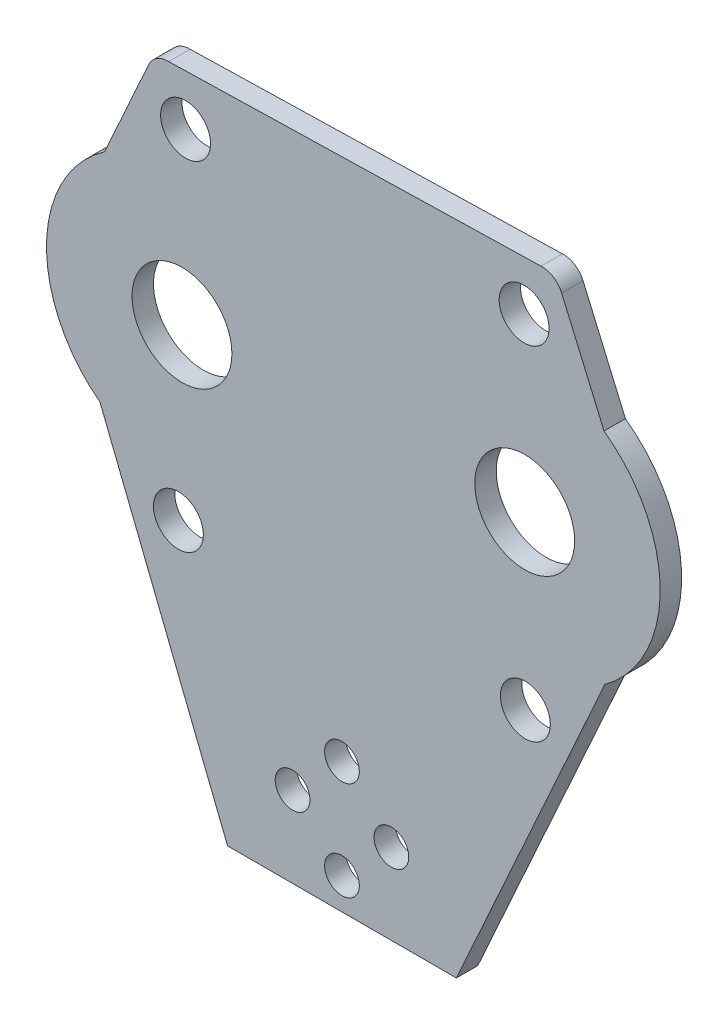
ISO-10303-21;
HEADER;
FILE_DESCRIPTION(('STEP AP214'),'2;1');
FILE_NAME('part.step','',(''),(''),'','','');
FILE_SCHEMA(('AUTOMOTIVE_DESIGN { 1 0 10303 214 1 1 1 1 }'));
ENDSEC;
DATA;
#1=APPLICATION_CONTEXT('core data for automotive mechanical design processes');
#2=APPLICATION_PROTOCOL_DEFINITION('international standard','automotive_design',2000,#1);
#3=PRODUCT_CONTEXT('',#1,'mechanical');
#4=PRODUCT('Part','Part','',(#3));
#5=PRODUCT_RELATED_PRODUCT_CATEGORY('part','',(#4));
#6=PRODUCT_DEFINITION_FORMATION('','',#4);
#7=PRODUCT_DEFINITION_CONTEXT('part definition',#1,'design');
#8=PRODUCT_DEFINITION('design','',#6,#7);
#9=PRODUCT_DEFINITION_SHAPE('','',#8);
#10=(LENGTH_UNIT() NAMED_UNIT(*) SI_UNIT(.MILLI.,.METRE.));
#11=(NAMED_UNIT(*) PLANE_ANGLE_UNIT() SI_UNIT($,.RADIAN.));
#12=(NAMED_UNIT(*) SI_UNIT($,.STERADIAN.) SOLID_ANGLE_UNIT());
#13=UNCERTAINTY_MEASURE_WITH_UNIT(LENGTH_MEASURE(1.E-05),#10,'distance_accuracy_value','');
#14=(GEOMETRIC_REPRESENTATION_CONTEXT(3) GLOBAL_UNCERTAINTY_ASSIGNED_CONTEXT((#13)) GLOBAL_UNIT_ASSIGNED_CONTEXT((#10,
#11,#12)) REPRESENTATION_CONTEXT('',''));
#15=CARTESIAN_POINT('',(0.,0.,0.));
#16=DIRECTION('',(0.,0.,1.));
#17=DIRECTION('',(1.,0.,0.));
#18=AXIS2_PLACEMENT_3D('',#15,#16,#17);
#19=CARTESIAN_POINT('',(0.,0.,0.));
#20=DIRECTION('',(0.,0.,1.));
#21=DIRECTION('',(1.,0.,0.));
#22=AXIS2_PLACEMENT_3D('',#19,#20,#21);
#23=PLANE('',#22);
#24=CARTESIAN_POINT('',(47.9795394637293,-77.5227826361399,0.));
#25=DIRECTION('',(0.,0.,1.));
#26=DIRECTION('',(1.,0.,0.));
#27=AXIS2_PLACEMENT_3D('',#24,#25,#26);
#28=CIRCLE('',#27,2.43527256951893);
#29=CARTESIAN_POINT('',(50.4148120332482,-77.5227826361399,0.));
#30=VERTEX_POINT('',#29);
#31=EDGE_CURVE('E237',#30,#30,#28,.T.);
#32=ORIENTED_EDGE('',*,*,#31,.T.);
#33=EDGE_LOOP('',(#32));
#34=FACE_BOUND('',#33,.T.);
#35=CARTESIAN_POINT('',(25.0430845381202,-59.7097072397897,0.));
#36=DIRECTION('',(0.,0.,1.));
#37=DIRECTION('',(1.,0.,0.));
#38=AXIS2_PLACEMENT_3D('',#35,#36,#37);
#39=CIRCLE('',#38,3.49999999999999);
#40=CARTESIAN_POINT('',(28.5430845381202,-59.7097072397897,0.));
#41=VERTEX_POINT('',#40);
#42=EDGE_CURVE('E241',#41,#41,#39,.T.);
#43=ORIENTED_EDGE('',*,*,#42,.T.);
#44=EDGE_LOOP('',(#43));
#45=FACE_BOUND('',#44,.T.);
#46=CARTESIAN_POINT('',(26.0475927384278,-11.7202191900561,0.));
#47=DIRECTION('',(0.,0.,1.));
#48=DIRECTION('',(1.,0.,0.));
#49=AXIS2_PLACEMENT_3D('',#46,#47,#48);
#50=CIRCLE('',#49,3.50000000000216);
#51=CARTESIAN_POINT('',(29.54759273843,-11.7202191900561,0.));
#52=VERTEX_POINT('',#51);
#53=EDGE_CURVE('E245',#52,#52,#50,.T.);
#54=ORIENTED_EDGE('',*,*,#53,.T.);
#55=EDGE_LOOP('',(#54));
#56=FACE_BOUND('',#55,.T.);
#57=CARTESIAN_POINT('',(73.6924071148828,-58.4168393325101,0.));
#58=DIRECTION('',(0.,0.,1.));
#59=DIRECTION('',(1.,0.,0.));
#60=AXIS2_PLACEMENT_3D('',#57,#58,#59);
#61=CIRCLE('',#60,3.50000000000217);
#62=CARTESIAN_POINT('',(77.1924071148849,-58.4168393325101,0.));
#63=VERTEX_POINT('',#62);
#64=EDGE_CURVE('E249',#63,#63,#61,.T.);
#65=ORIENTED_EDGE('',*,*,#64,.T.);
#66=EDGE_LOOP('',(#65));
#67=FACE_BOUND('',#66,.T.);
#68=CARTESIAN_POINT('',(54.9066241544598,-84.4498673268705,0.));
#69=DIRECTION('',(0.,0.,1.));
#70=DIRECTION('',(1.,0.,0.));
#71=AXIS2_PLACEMENT_3D('',#68,#69,#70);
#72=CIRCLE('',#71,2.43527256951893);
#73=CARTESIAN_POINT('',(57.3418967239788,-84.4498673268705,0.));
#74=VERTEX_POINT('',#73);
#75=EDGE_CURVE('E253',#74,#74,#72,.T.);
#76=ORIENTED_EDGE('',*,*,#75,.T.);
#77=EDGE_LOOP('',(#76));
#78=FACE_BOUND('',#77,.T.);
#79=CARTESIAN_POINT('',(25.5453386382778,-35.714963214923,0.));
#80=DIRECTION('',(0.,0.,1.));
#81=DIRECTION('',(1.,0.,0.));
#82=AXIS2_PLACEMENT_3D('',#79,#80,#81);
#83=CIRCLE('',#82,7.);
#84=CARTESIAN_POINT('',(32.5453386382778,-35.714963214923,0.));
#85=VERTEX_POINT('',#84);
#86=EDGE_CURVE('E257',#85,#85,#83,.T.);
#87=ORIENTED_EDGE('',*,*,#86,.T.);
#88=EDGE_LOOP('',(#87));
#89=FACE_BOUND('',#88,.T.);
#90=CARTESIAN_POINT('',(47.9795394637292,-91.3769520176011,0.));
#91=DIRECTION('',(0.,0.,1.));
#92=DIRECTION('',(1.,0.,0.));
#93=AXIS2_PLACEMENT_3D('',#90,#91,#92);
#94=CIRCLE('',#93,2.43527256951894);
#95=CARTESIAN_POINT('',(50.4148120332481,-91.3769520176011,0.));
#96=VERTEX_POINT('',#95);
#97=EDGE_CURVE('E261',#96,#96,#94,.T.);
#98=ORIENTED_EDGE('',*,*,#97,.T.);
#99=EDGE_LOOP('',(#98));
#100=FACE_BOUND('',#99,.T.);
#101=CARTESIAN_POINT('',(41.0524547729986,-84.4498673268704,0.));
#102=DIRECTION('',(0.,0.,1.));
#103=DIRECTION('',(1.,0.,0.));
#104=AXIS2_PLACEMENT_3D('',#101,#102,#103);
#105=CIRCLE('',#104,2.43527256951893);
#106=CARTESIAN_POINT('',(43.4877273425175,-84.4498673268704,0.));
#107=VERTEX_POINT('',#106);
#108=EDGE_CURVE('E265',#107,#107,#105,.T.);
#109=ORIENTED_EDGE('',*,*,#108,.T.);
#110=EDGE_LOOP('',(#109));
#111=FACE_BOUND('',#110,.T.);
#112=CARTESIAN_POINT('',(73.5196330549074,-10.4171502801402,0.));
#113=DIRECTION('',(0.,0.,1.));
#114=DIRECTION('',(1.,0.,0.));
#115=AXIS2_PLACEMENT_3D('',#112,#113,#114);
#116=CIRCLE('',#115,3.49999999999999);
#117=CARTESIAN_POINT('',(77.0196330549074,-10.4171502801402,0.));
#118=VERTEX_POINT('',#117);
#119=EDGE_CURVE('E269',#118,#118,#116,.T.);
#120=ORIENTED_EDGE('',*,*,#119,.T.);
#121=EDGE_LOOP('',(#120));
#122=FACE_BOUND('',#121,.T.);
#123=CARTESIAN_POINT('',(73.6060200848913,-34.4169948063252,0.));
#124=DIRECTION('',(0.,0.,1.));
#125=DIRECTION('',(1.,0.,0.));
#126=AXIS2_PLACEMENT_3D('',#123,#124,#125);
#127=CIRCLE('',#126,7.00000000000002);
#128=CARTESIAN_POINT('',(80.6060200848913,-34.4169948063252,0.));
#129=VERTEX_POINT('',#128);
#130=EDGE_CURVE('E152',#129,#129,#127,.T.);
#131=ORIENTED_EDGE('',*,*,#130,.T.);
#132=EDGE_LOOP('',(#131));
#133=FACE_BOUND('',#132,.T.);
#134=CARTESIAN_POINT('',(23.6128119382138,-7.66837856449386,0.));
#135=DIRECTION('',(0.,0.,1.));
#136=DIRECTION('',(1.,0.,0.));
#137=AXIS2_PLACEMENT_3D('',#134,#135,#136);
#138=CIRCLE('',#137,3.);
#139=CARTESIAN_POINT('',(23.6755937007325,-4.66903556138551,0.));
#140=VERTEX_POINT('',#139);
#141=CARTESIAN_POINT('',(20.8791196646464,-6.43268986848738,0.));
#142=VERTEX_POINT('',#141);
#143=EDGE_CURVE('E117',#140,#142,#138,.T.);
#144=ORIENTED_EDGE('',*,*,#143,.F.);
#145=DIRECTION('',(-0.999709921768373,-0.0240846905289178,0.));
#146=VECTOR('',#145,1.);
#147=CARTESIAN_POINT('',(0.126153213121975,-5.23638112225579,0.));
#148=LINE('',#147,#146);
#149=CARTESIAN_POINT('',(75.8905809448477,-3.41108884968199,0.));
#150=VERTEX_POINT('',#149);
#151=EDGE_CURVE('E110',#150,#140,#148,.T.);
#152=ORIENTED_EDGE('',*,*,#151,.F.);
#153=CARTESIAN_POINT('',(76.0242603824249,-6.40810900443055,0.));
#154=DIRECTION('',(0.,0.,1.));
#155=DIRECTION('',(1.,0.,0.));
#156=AXIS2_PLACEMENT_3D('',#153,#154,#155);
#157=CIRCLE('',#156,3.00000000000001);
#158=CARTESIAN_POINT('',(78.7789547617845,-5.2199764881157,0.));
#159=VERTEX_POINT('',#158);
#160=EDGE_CURVE('E116',#159,#150,#157,.T.);
#161=ORIENTED_EDGE('',*,*,#160,.F.);
#162=DIRECTION('',(-0.396044172104949,0.918231459786532,0.));
#163=VECTOR('',#162,1.);
#164=CARTESIAN_POINT('',(64.5241002218544,27.8300134250703,0.));
#165=LINE('',#164,#163);
#166=CARTESIAN_POINT('',(84.7276966295057,-19.0121802719994,0.));
#167=VERTEX_POINT('',#166);
#168=EDGE_CURVE('E135',#167,#159,#165,.T.);
#169=ORIENTED_EDGE('',*,*,#168,.F.);
#170=CARTESIAN_POINT('',(73.6060200848913,-34.4169948063252,0.));
#171=DIRECTION('',(0.,0.,1.));
#172=DIRECTION('',(1.,0.,0.));
#173=AXIS2_PLACEMENT_3D('',#170,#171,#172);
#174=CIRCLE('',#173,19.);
#175=CARTESIAN_POINT('',(84.8383057383807,-49.7413466359595,0.));
#176=VERTEX_POINT('',#175);
#177=EDGE_CURVE('E137',#176,#167,#174,.T.);
#178=ORIENTED_EDGE('',*,*,#177,.F.);
#179=DIRECTION('',(-0.411896232002161,-0.911230757855781,0.));
#180=VECTOR('',#179,1.);
#181=CARTESIAN_POINT('',(89.1143103049896,-40.2816172694491,0.));
#182=LINE('',#181,#180);
#183=CARTESIAN_POINT('',(64.0242125998881,-95.7879972024786,0.));
#184=VERTEX_POINT('',#183);
#185=EDGE_CURVE('E139',#176,#184,#182,.T.);
#186=ORIENTED_EDGE('',*,*,#185,.T.);
#187=DIRECTION('',(-1.,0.,0.));
#188=VECTOR('',#187,1.);
#189=CARTESIAN_POINT('',(0.,-95.7879972024786,0.));
#190=LINE('',#189,#188);
#191=CARTESIAN_POINT('',(31.9348663275706,-95.7879972024786,0.));
#192=VERTEX_POINT('',#191);
#193=EDGE_CURVE('E142',#184,#192,#190,.T.);
#194=ORIENTED_EDGE('',*,*,#193,.T.);
#195=DIRECTION('',(0.369740315998058,-0.929135134803144,0.));
#196=VECTOR('',#195,1.);
#197=CARTESIAN_POINT('',(-5.33776801751495,-2.12411301606676,0.));
#198=LINE('',#197,#196);
#199=CARTESIAN_POINT('',(14.0491922760877,-50.8423760412824,0.));
#200=VERTEX_POINT('',#199);
#201=EDGE_CURVE('E145',#200,#192,#198,.T.);
#202=ORIENTED_EDGE('',*,*,#201,.F.);
#203=CARTESIAN_POINT('',(25.5453386382778,-35.714963214923,0.));
#204=DIRECTION('',(0.,0.,1.));
#205=DIRECTION('',(1.,0.,0.));
#206=AXIS2_PLACEMENT_3D('',#203,#204,#205);
#207=CIRCLE('',#206,19.);
#208=CARTESIAN_POINT('',(14.692273517042,-20.1197403093594,0.));
#209=VERTEX_POINT('',#208);
#210=EDGE_CURVE('E147',#209,#200,#207,.T.);
#211=ORIENTED_EDGE('',*,*,#210,.F.);
#212=DIRECTION('',(0.411896232002162,0.911230757855781,0.));
#213=VECTOR('',#212,1.);
#214=CARTESIAN_POINT('',(19.7511970877558,-8.92797306043775,0.));
#215=LINE('',#214,#213);
#216=EDGE_CURVE('E121',#209,#142,#215,.T.);
#217=ORIENTED_EDGE('',*,*,#216,.T.);
#218=EDGE_LOOP('',(#144,#152,#161,#169,#178,#186,#194,#202,#211,#217));
#219=FACE_BOUND('',#218,.T.);
#220=ADVANCED_FACE('F34',(#34,#45,#56,#67,#78,#89,#100,#111,#122,#133,#219),#23,.F.);
#221=CARTESIAN_POINT('',(23.6128119382138,-7.66837856449386,0.));
#222=DIRECTION('',(0.,0.,1.));
#223=DIRECTION('',(1.,0.,0.));
#224=AXIS2_PLACEMENT_3D('',#221,#222,#223);
#225=CYLINDRICAL_SURFACE('',#224,3.);
#226=CARTESIAN_POINT('',(23.6128119382138,-7.66837856449386,3.));
#227=DIRECTION('',(0.,0.,1.));
#228=DIRECTION('',(1.,0.,0.));
#229=AXIS2_PLACEMENT_3D('',#226,#227,#228);
#230=CIRCLE('',#229,3.);
#231=CARTESIAN_POINT('',(23.6755937007325,-4.66903556138551,3.));
#232=VERTEX_POINT('',#231);
#233=CARTESIAN_POINT('',(20.8791196646464,-6.43268986848738,3.));
#234=VERTEX_POINT('',#233);
#235=EDGE_CURVE('E49',#232,#234,#230,.T.);
#236=ORIENTED_EDGE('',*,*,#235,.F.);
#237=DIRECTION('',(0.,0.,1.));
#238=VECTOR('',#237,1.);
#239=CARTESIAN_POINT('',(23.6755937007325,-4.66903556138551,0.));
#240=LINE('',#239,#238);
#241=EDGE_CURVE('E37',#140,#232,#240,.T.);
#242=ORIENTED_EDGE('',*,*,#241,.F.);
#243=ORIENTED_EDGE('',*,*,#143,.T.);
#244=DIRECTION('',(0.,0.,1.));
#245=VECTOR('',#244,1.);
#246=CARTESIAN_POINT('',(20.8791196646464,-6.43268986848738,0.));
#247=LINE('',#246,#245);
#248=EDGE_CURVE('E12',#142,#234,#247,.T.);
#249=ORIENTED_EDGE('',*,*,#248,.T.);
#250=EDGE_LOOP('',(#236,#242,#243,#249));
#251=FACE_BOUND('',#250,.T.);
#252=ADVANCED_FACE('F119',(#251),#225,.T.);
#253=CARTESIAN_POINT('',(19.7511970877558,-8.92797306043775,0.));
#254=DIRECTION('',(0.911230757855781,-0.411896232002162,0.));
#255=DIRECTION('',(0.411896232002162,0.911230757855781,0.));
#256=AXIS2_PLACEMENT_3D('',#253,#254,#255);
#257=PLANE('',#256);
#258=DIRECTION('',(0.411896232002162,0.911230757855781,0.));
#259=VECTOR('',#258,1.);
#260=CARTESIAN_POINT('',(19.7511970877558,-8.92797306043775,3.));
#261=LINE('',#260,#259);
#262=CARTESIAN_POINT('',(14.692273517042,-20.1197403093594,3.));
#263=VERTEX_POINT('',#262);
#264=EDGE_CURVE('E125',#263,#234,#261,.T.);
#265=ORIENTED_EDGE('',*,*,#264,.T.);
#266=ORIENTED_EDGE('',*,*,#248,.F.);
#267=ORIENTED_EDGE('',*,*,#216,.F.);
#268=DIRECTION('',(0.,0.,1.));
#269=VECTOR('',#268,1.);
#270=CARTESIAN_POINT('',(14.692273517042,-20.1197403093594,0.));
#271=LINE('',#270,#269);
#272=EDGE_CURVE('E42',#209,#263,#271,.T.);
#273=ORIENTED_EDGE('',*,*,#272,.T.);
#274=EDGE_LOOP('',(#265,#266,#267,#273));
#275=FACE_BOUND('',#274,.T.);
#276=ADVANCED_FACE('F220',(#275),#257,.F.);
#277=CARTESIAN_POINT('',(25.5453386382778,-35.714963214923,0.));
#278=DIRECTION('',(0.,0.,1.));
#279=DIRECTION('',(1.,0.,0.));
#280=AXIS2_PLACEMENT_3D('',#277,#278,#279);
#281=CYLINDRICAL_SURFACE('',#280,19.);
#282=CARTESIAN_POINT('',(25.5453386382778,-35.714963214923,3.));
#283=DIRECTION('',(0.,0.,1.));
#284=DIRECTION('',(1.,0.,0.));
#285=AXIS2_PLACEMENT_3D('',#282,#283,#284);
#286=CIRCLE('',#285,19.);
#287=CARTESIAN_POINT('',(14.0491922760877,-50.8423760412824,3.));
#288=VERTEX_POINT('',#287);
#289=EDGE_CURVE('E128',#263,#288,#286,.T.);
#290=ORIENTED_EDGE('',*,*,#289,.F.);
#291=ORIENTED_EDGE('',*,*,#272,.F.);
#292=ORIENTED_EDGE('',*,*,#210,.T.);
#293=DIRECTION('',(0.,0.,1.));
#294=VECTOR('',#293,1.);
#295=CARTESIAN_POINT('',(14.0491922760877,-50.8423760412824,0.));
#296=LINE('',#295,#294);
#297=EDGE_CURVE('E175',#200,#288,#296,.T.);
#298=ORIENTED_EDGE('',*,*,#297,.T.);
#299=EDGE_LOOP('',(#290,#291,#292,#298));
#300=FACE_BOUND('',#299,.T.);
#301=ADVANCED_FACE('F217',(#300),#281,.T.);
#302=CARTESIAN_POINT('',(-5.33776801751495,-2.12411301606676,0.));
#303=DIRECTION('',(-0.929135134803144,-0.369740315998058,0.));
#304=DIRECTION('',(0.369740315998058,-0.929135134803144,0.));
#305=AXIS2_PLACEMENT_3D('',#302,#303,#304);
#306=PLANE('',#305);
#307=DIRECTION('',(0.369740315998058,-0.929135134803144,0.));
#308=VECTOR('',#307,1.);
#309=CARTESIAN_POINT('',(-5.33776801751495,-2.12411301606676,3.));
#310=LINE('',#309,#308);
#311=CARTESIAN_POINT('',(31.9348663275706,-95.7879972024786,3.));
#312=VERTEX_POINT('',#311);
#313=EDGE_CURVE('E169',#288,#312,#310,.T.);
#314=ORIENTED_EDGE('',*,*,#313,.F.);
#315=ORIENTED_EDGE('',*,*,#297,.F.);
#316=ORIENTED_EDGE('',*,*,#201,.T.);
#317=DIRECTION('',(0.,0.,1.));
#318=VECTOR('',#317,1.);
#319=CARTESIAN_POINT('',(31.9348663275706,-95.7879972024786,0.));
#320=LINE('',#319,#318);
#321=EDGE_CURVE('E177',#192,#312,#320,.T.);
#322=ORIENTED_EDGE('',*,*,#321,.T.);
#323=EDGE_LOOP('',(#314,#315,#316,#322));
#324=FACE_BOUND('',#323,.T.);
#325=ADVANCED_FACE('F214',(#324),#306,.T.);
#326=CARTESIAN_POINT('',(0.,-95.7879972024786,0.));
#327=DIRECTION('',(0.,1.,0.));
#328=DIRECTION('',(0.,0.,1.));
#329=AXIS2_PLACEMENT_3D('',#326,#327,#328);
#330=PLANE('',#329);
#331=DIRECTION('',(-1.,0.,0.));
#332=VECTOR('',#331,1.);
#333=CARTESIAN_POINT('',(0.,-95.7879972024786,3.));
#334=LINE('',#333,#332);
#335=CARTESIAN_POINT('',(64.0242125998881,-95.7879972024786,3.));
#336=VERTEX_POINT('',#335);
#337=EDGE_CURVE('E166',#336,#312,#334,.T.);
#338=ORIENTED_EDGE('',*,*,#337,.T.);
#339=ORIENTED_EDGE('',*,*,#321,.F.);
#340=ORIENTED_EDGE('',*,*,#193,.F.);
#341=DIRECTION('',(0.,0.,1.));
#342=VECTOR('',#341,1.);
#343=CARTESIAN_POINT('',(64.0242125998881,-95.7879972024786,0.));
#344=LINE('',#343,#342);
#345=EDGE_CURVE('E179',#184,#336,#344,.T.);
#346=ORIENTED_EDGE('',*,*,#345,.T.);
#347=EDGE_LOOP('',(#338,#339,#340,#346));
#348=FACE_BOUND('',#347,.T.);
#349=ADVANCED_FACE('F209',(#348),#330,.F.);
#350=CARTESIAN_POINT('',(89.1143103049896,-40.2816172694491,0.));
#351=DIRECTION('',(-0.911230757855781,0.411896232002161,0.));
#352=DIRECTION('',(-0.411896232002162,-0.911230757855781,0.));
#353=AXIS2_PLACEMENT_3D('',#350,#351,#352);
#354=PLANE('',#353);
#355=DIRECTION('',(-0.411896232002161,-0.911230757855781,0.));
#356=VECTOR('',#355,1.);
#357=CARTESIAN_POINT('',(89.1143103049896,-40.2816172694491,3.));
#358=LINE('',#357,#356);
#359=CARTESIAN_POINT('',(84.8383057383807,-49.7413466359595,3.));
#360=VERTEX_POINT('',#359);
#361=EDGE_CURVE('E163',#360,#336,#358,.T.);
#362=ORIENTED_EDGE('',*,*,#361,.T.);
#363=ORIENTED_EDGE('',*,*,#345,.F.);
#364=ORIENTED_EDGE('',*,*,#185,.F.);
#365=DIRECTION('',(0.,0.,1.));
#366=VECTOR('',#365,1.);
#367=CARTESIAN_POINT('',(84.8383057383807,-49.7413466359595,0.));
#368=LINE('',#367,#366);
#369=EDGE_CURVE('E181',#176,#360,#368,.T.);
#370=ORIENTED_EDGE('',*,*,#369,.T.);
#371=EDGE_LOOP('',(#362,#363,#364,#370));
#372=FACE_BOUND('',#371,.T.);
#373=ADVANCED_FACE('F204',(#372),#354,.F.);
#374=CARTESIAN_POINT('',(73.6060200848913,-34.4169948063252,0.));
#375=DIRECTION('',(0.,0.,1.));
#376=DIRECTION('',(1.,0.,0.));
#377=AXIS2_PLACEMENT_3D('',#374,#375,#376);
#378=CYLINDRICAL_SURFACE('',#377,19.);
#379=CARTESIAN_POINT('',(73.6060200848913,-34.4169948063252,3.));
#380=DIRECTION('',(0.,0.,1.));
#381=DIRECTION('',(1.,0.,0.));
#382=AXIS2_PLACEMENT_3D('',#379,#380,#381);
#383=CIRCLE('',#382,19.);
#384=CARTESIAN_POINT('',(84.7276966295057,-19.0121802719994,3.));
#385=VERTEX_POINT('',#384);
#386=EDGE_CURVE('E160',#360,#385,#383,.T.);
#387=ORIENTED_EDGE('',*,*,#386,.F.);
#388=ORIENTED_EDGE('',*,*,#369,.F.);
#389=ORIENTED_EDGE('',*,*,#177,.T.);
#390=DIRECTION('',(0.,0.,1.));
#391=VECTOR('',#390,1.);
#392=CARTESIAN_POINT('',(84.7276966295057,-19.0121802719994,0.));
#393=LINE('',#392,#391);
#394=EDGE_CURVE('E183',#167,#385,#393,.T.);
#395=ORIENTED_EDGE('',*,*,#394,.T.);
#396=EDGE_LOOP('',(#387,#388,#389,#395));
#397=FACE_BOUND('',#396,.T.);
#398=ADVANCED_FACE('F202',(#397),#378,.T.);
#399=CARTESIAN_POINT('',(64.5241002218544,27.8300134250703,0.));
#400=DIRECTION('',(0.918231459786532,0.396044172104949,0.));
#401=DIRECTION('',(-0.396044172104949,0.918231459786532,0.));
#402=AXIS2_PLACEMENT_3D('',#399,#400,#401);
#403=PLANE('',#402);
#404=DIRECTION('',(-0.396044172104949,0.918231459786532,0.));
#405=VECTOR('',#404,1.);
#406=CARTESIAN_POINT('',(64.5241002218544,27.8300134250703,3.));
#407=LINE('',#406,#405);
#408=CARTESIAN_POINT('',(78.7789547617845,-5.2199764881157,3.));
#409=VERTEX_POINT('',#408);
#410=EDGE_CURVE('E157',#385,#409,#407,.T.);
#411=ORIENTED_EDGE('',*,*,#410,.F.);
#412=ORIENTED_EDGE('',*,*,#394,.F.);
#413=ORIENTED_EDGE('',*,*,#168,.T.);
#414=DIRECTION('',(0.,0.,1.));
#415=VECTOR('',#414,1.);
#416=CARTESIAN_POINT('',(78.7789547617845,-5.2199764881157,0.));
#417=LINE('',#416,#415);
#418=EDGE_CURVE('E185',#159,#409,#417,.T.);
#419=ORIENTED_EDGE('',*,*,#418,.T.);
#420=EDGE_LOOP('',(#411,#412,#413,#419));
#421=FACE_BOUND('',#420,.T.);
#422=ADVANCED_FACE('F197',(#421),#403,.T.);
#423=CARTESIAN_POINT('',(76.0242603824249,-6.40810900443055,0.));
#424=DIRECTION('',(0.,0.,1.));
#425=DIRECTION('',(1.,0.,0.));
#426=AXIS2_PLACEMENT_3D('',#423,#424,#425);
#427=CYLINDRICAL_SURFACE('',#426,3.00000000000001);
#428=CARTESIAN_POINT('',(76.0242603824249,-6.40810900443055,3.));
#429=DIRECTION('',(0.,0.,1.));
#430=DIRECTION('',(1.,0.,0.));
#431=AXIS2_PLACEMENT_3D('',#428,#429,#430);
#432=CIRCLE('',#431,3.00000000000001);
#433=CARTESIAN_POINT('',(75.8905809448477,-3.41108884968199,3.));
#434=VERTEX_POINT('',#433);
#435=EDGE_CURVE('E154',#409,#434,#432,.T.);
#436=ORIENTED_EDGE('',*,*,#435,.F.);
#437=ORIENTED_EDGE('',*,*,#418,.F.);
#438=ORIENTED_EDGE('',*,*,#160,.T.);
#439=DIRECTION('',(0.,0.,1.));
#440=VECTOR('',#439,1.);
#441=CARTESIAN_POINT('',(75.8905809448477,-3.41108884968199,0.));
#442=LINE('',#441,#440);
#443=EDGE_CURVE('E57',#150,#434,#442,.T.);
#444=ORIENTED_EDGE('',*,*,#443,.T.);
#445=EDGE_LOOP('',(#436,#437,#438,#444));
#446=FACE_BOUND('',#445,.T.);
#447=ADVANCED_FACE('F188',(#446),#427,.T.);
#448=CARTESIAN_POINT('',(0.126153213121975,-5.23638112225579,0.));
#449=DIRECTION('',(-0.0240846905289178,0.999709921768373,0.));
#450=DIRECTION('',(-0.999709921768373,-0.0240846905289178,0.));
#451=AXIS2_PLACEMENT_3D('',#448,#449,#450);
#452=PLANE('',#451);
#453=DIRECTION('',(-0.999709921768373,-0.0240846905289178,0.));
#454=VECTOR('',#453,1.);
#455=CARTESIAN_POINT('',(0.126153213121975,-5.23638112225579,3.));
#456=LINE('',#455,#454);
#457=EDGE_CURVE('E151',#434,#232,#456,.T.);
#458=ORIENTED_EDGE('',*,*,#457,.F.);
#459=ORIENTED_EDGE('',*,*,#443,.F.);
#460=ORIENTED_EDGE('',*,*,#151,.T.);
#461=ORIENTED_EDGE('',*,*,#241,.T.);
#462=EDGE_LOOP('',(#458,#459,#460,#461));
#463=FACE_BOUND('',#462,.T.);
#464=ADVANCED_FACE('F111',(#463),#452,.T.);
#465=CARTESIAN_POINT('',(0.,0.,3.));
#466=DIRECTION('',(0.,0.,1.));
#467=DIRECTION('',(1.,0.,0.));
#468=AXIS2_PLACEMENT_3D('',#465,#466,#467);
#469=PLANE('',#468);
#470=CARTESIAN_POINT('',(47.9795394637293,-77.5227826361399,3.));
#471=DIRECTION('',(0.,0.,1.));
#472=DIRECTION('',(1.,0.,0.));
#473=AXIS2_PLACEMENT_3D('',#470,#471,#472);
#474=CIRCLE('',#473,2.43527256951893);
#475=CARTESIAN_POINT('',(50.4148120332482,-77.5227826361399,3.));
#476=VERTEX_POINT('',#475);
#477=EDGE_CURVE('E295',#476,#476,#474,.T.);
#478=ORIENTED_EDGE('',*,*,#477,.F.);
#479=EDGE_LOOP('',(#478));
#480=FACE_BOUND('',#479,.T.);
#481=CARTESIAN_POINT('',(25.0430845381202,-59.7097072397897,3.));
#482=DIRECTION('',(0.,0.,1.));
#483=DIRECTION('',(1.,0.,0.));
#484=AXIS2_PLACEMENT_3D('',#481,#482,#483);
#485=CIRCLE('',#484,3.49999999999999);
#486=CARTESIAN_POINT('',(28.5430845381202,-59.7097072397897,3.));
#487=VERTEX_POINT('',#486);
#488=EDGE_CURVE('E291',#487,#487,#485,.T.);
#489=ORIENTED_EDGE('',*,*,#488,.F.);
#490=EDGE_LOOP('',(#489));
#491=FACE_BOUND('',#490,.T.);
#492=CARTESIAN_POINT('',(26.0475927384278,-11.7202191900561,3.));
#493=DIRECTION('',(0.,0.,1.));
#494=DIRECTION('',(1.,0.,0.));
#495=AXIS2_PLACEMENT_3D('',#492,#493,#494);
#496=CIRCLE('',#495,3.50000000000216);
#497=CARTESIAN_POINT('',(29.54759273843,-11.7202191900561,3.));
#498=VERTEX_POINT('',#497);
#499=EDGE_CURVE('E303',#498,#498,#496,.T.);
#500=ORIENTED_EDGE('',*,*,#499,.F.);
#501=EDGE_LOOP('',(#500));
#502=FACE_BOUND('',#501,.T.);
#503=CARTESIAN_POINT('',(73.6924071148828,-58.4168393325101,3.));
#504=DIRECTION('',(0.,0.,1.));
#505=DIRECTION('',(1.,0.,0.));
#506=AXIS2_PLACEMENT_3D('',#503,#504,#505);
#507=CIRCLE('',#506,3.50000000000217);
#508=CARTESIAN_POINT('',(77.1924071148849,-58.4168393325101,3.));
#509=VERTEX_POINT('',#508);
#510=EDGE_CURVE('E299',#509,#509,#507,.T.);
#511=ORIENTED_EDGE('',*,*,#510,.F.);
#512=EDGE_LOOP('',(#511));
#513=FACE_BOUND('',#512,.T.);
#514=CARTESIAN_POINT('',(54.9066241544598,-84.4498673268705,3.));
#515=DIRECTION('',(0.,0.,1.));
#516=DIRECTION('',(1.,0.,0.));
#517=AXIS2_PLACEMENT_3D('',#514,#515,#516);
#518=CIRCLE('',#517,2.43527256951893);
#519=CARTESIAN_POINT('',(57.3418967239788,-84.4498673268705,3.));
#520=VERTEX_POINT('',#519);
#521=EDGE_CURVE('E279',#520,#520,#518,.T.);
#522=ORIENTED_EDGE('',*,*,#521,.F.);
#523=EDGE_LOOP('',(#522));
#524=FACE_BOUND('',#523,.T.);
#525=CARTESIAN_POINT('',(25.5453386382778,-35.714963214923,3.));
#526=DIRECTION('',(0.,0.,1.));
#527=DIRECTION('',(1.,0.,0.));
#528=AXIS2_PLACEMENT_3D('',#525,#526,#527);
#529=CIRCLE('',#528,7.);
#530=CARTESIAN_POINT('',(32.5453386382778,-35.714963214923,3.));
#531=VERTEX_POINT('',#530);
#532=EDGE_CURVE('E275',#531,#531,#529,.T.);
#533=ORIENTED_EDGE('',*,*,#532,.F.);
#534=EDGE_LOOP('',(#533));
#535=FACE_BOUND('',#534,.T.);
#536=CARTESIAN_POINT('',(47.9795394637292,-91.3769520176011,3.));
#537=DIRECTION('',(0.,0.,1.));
#538=DIRECTION('',(1.,0.,0.));
#539=AXIS2_PLACEMENT_3D('',#536,#537,#538);
#540=CIRCLE('',#539,2.43527256951894);
#541=CARTESIAN_POINT('',(50.4148120332481,-91.3769520176011,3.));
#542=VERTEX_POINT('',#541);
#543=EDGE_CURVE('E287',#542,#542,#540,.T.);
#544=ORIENTED_EDGE('',*,*,#543,.F.);
#545=EDGE_LOOP('',(#544));
#546=FACE_BOUND('',#545,.T.);
#547=CARTESIAN_POINT('',(41.0524547729986,-84.4498673268704,3.));
#548=DIRECTION('',(0.,0.,1.));
#549=DIRECTION('',(1.,0.,0.));
#550=AXIS2_PLACEMENT_3D('',#547,#548,#549);
#551=CIRCLE('',#550,2.43527256951893);
#552=CARTESIAN_POINT('',(43.4877273425175,-84.4498673268704,3.));
#553=VERTEX_POINT('',#552);
#554=EDGE_CURVE('E283',#553,#553,#551,.T.);
#555=ORIENTED_EDGE('',*,*,#554,.F.);
#556=EDGE_LOOP('',(#555));
#557=FACE_BOUND('',#556,.T.);
#558=CARTESIAN_POINT('',(73.5196330549074,-10.4171502801402,3.));
#559=DIRECTION('',(0.,0.,1.));
#560=DIRECTION('',(1.,0.,0.));
#561=AXIS2_PLACEMENT_3D('',#558,#559,#560);
#562=CIRCLE('',#561,3.49999999999999);
#563=CARTESIAN_POINT('',(77.0196330549074,-10.4171502801402,3.));
#564=VERTEX_POINT('',#563);
#565=EDGE_CURVE('E307',#564,#564,#562,.T.);
#566=ORIENTED_EDGE('',*,*,#565,.F.);
#567=EDGE_LOOP('',(#566));
#568=FACE_BOUND('',#567,.T.);
#569=CARTESIAN_POINT('',(73.6060200848913,-34.4169948063252,3.));
#570=DIRECTION('',(0.,0.,1.));
#571=DIRECTION('',(1.,0.,0.));
#572=AXIS2_PLACEMENT_3D('',#569,#570,#571);
#573=CIRCLE('',#572,7.00000000000002);
#574=CARTESIAN_POINT('',(80.6060200848913,-34.4169948063252,3.));
#575=VERTEX_POINT('',#574);
#576=EDGE_CURVE('E131',#575,#575,#573,.T.);
#577=ORIENTED_EDGE('',*,*,#576,.F.);
#578=EDGE_LOOP('',(#577));
#579=FACE_BOUND('',#578,.T.);
#580=ORIENTED_EDGE('',*,*,#457,.T.);
#581=ORIENTED_EDGE('',*,*,#235,.T.);
#582=ORIENTED_EDGE('',*,*,#264,.F.);
#583=ORIENTED_EDGE('',*,*,#289,.T.);
#584=ORIENTED_EDGE('',*,*,#313,.T.);
#585=ORIENTED_EDGE('',*,*,#337,.F.);
#586=ORIENTED_EDGE('',*,*,#361,.F.);
#587=ORIENTED_EDGE('',*,*,#386,.T.);
#588=ORIENTED_EDGE('',*,*,#410,.T.);
#589=ORIENTED_EDGE('',*,*,#435,.T.);
#590=EDGE_LOOP('',(#580,#581,#582,#583,#584,#585,#586,#587,#588,#589));
#591=FACE_BOUND('',#590,.T.);
#592=ADVANCED_FACE('F191',(#480,#491,#502,#513,#524,#535,#546,#557,#568,#579,#591),#469,.T.);
#593=CARTESIAN_POINT('',(73.6060200848913,-34.4169948063252,0.));
#594=DIRECTION('',(0.,0.,1.));
#595=DIRECTION('',(1.,0.,0.));
#596=AXIS2_PLACEMENT_3D('',#593,#594,#595);
#597=CYLINDRICAL_SURFACE('',#596,7.00000000000002);
#598=ORIENTED_EDGE('',*,*,#130,.F.);
#599=EDGE_LOOP('',(#598));
#600=FACE_BOUND('',#599,.T.);
#601=ORIENTED_EDGE('',*,*,#576,.T.);
#602=EDGE_LOOP('',(#601));
#603=FACE_BOUND('',#602,.T.);
#604=ADVANCED_FACE('F316',(#600,#603),#597,.F.);
#605=CARTESIAN_POINT('',(73.5196330549074,-10.4171502801402,0.));
#606=DIRECTION('',(0.,0.,1.));
#607=DIRECTION('',(1.,0.,0.));
#608=AXIS2_PLACEMENT_3D('',#605,#606,#607);
#609=CYLINDRICAL_SURFACE('',#608,3.49999999999999);
#610=ORIENTED_EDGE('',*,*,#119,.F.);
#611=EDGE_LOOP('',(#610));
#612=FACE_BOUND('',#611,.T.);
#613=ORIENTED_EDGE('',*,*,#565,.T.);
#614=EDGE_LOOP('',(#613));
#615=FACE_BOUND('',#614,.T.);
#616=ADVANCED_FACE('F312',(#612,#615),#609,.F.);
#617=CARTESIAN_POINT('',(41.0524547729986,-84.4498673268704,0.));
#618=DIRECTION('',(0.,0.,1.));
#619=DIRECTION('',(1.,0.,0.));
#620=AXIS2_PLACEMENT_3D('',#617,#618,#619);
#621=CYLINDRICAL_SURFACE('',#620,2.43527256951893);
#622=ORIENTED_EDGE('',*,*,#108,.F.);
#623=EDGE_LOOP('',(#622));
#624=FACE_BOUND('',#623,.T.);
#625=ORIENTED_EDGE('',*,*,#554,.T.);
#626=EDGE_LOOP('',(#625));
#627=FACE_BOUND('',#626,.T.);
#628=ADVANCED_FACE('F324',(#624,#627),#621,.F.);
#629=CARTESIAN_POINT('',(47.9795394637292,-91.3769520176011,0.));
#630=DIRECTION('',(0.,0.,1.));
#631=DIRECTION('',(1.,0.,0.));
#632=AXIS2_PLACEMENT_3D('',#629,#630,#631);
#633=CYLINDRICAL_SURFACE('',#632,2.43527256951894);
#634=ORIENTED_EDGE('',*,*,#97,.F.);
#635=EDGE_LOOP('',(#634));
#636=FACE_BOUND('',#635,.T.);
#637=ORIENTED_EDGE('',*,*,#543,.T.);
#638=EDGE_LOOP('',(#637));
#639=FACE_BOUND('',#638,.T.);
#640=ADVANCED_FACE('F332',(#636,#639),#633,.F.);
#641=CARTESIAN_POINT('',(25.5453386382778,-35.714963214923,0.));
#642=DIRECTION('',(0.,0.,1.));
#643=DIRECTION('',(1.,0.,0.));
#644=AXIS2_PLACEMENT_3D('',#641,#642,#643);
#645=CYLINDRICAL_SURFACE('',#644,7.);
#646=ORIENTED_EDGE('',*,*,#86,.F.);
#647=EDGE_LOOP('',(#646));
#648=FACE_BOUND('',#647,.T.);
#649=ORIENTED_EDGE('',*,*,#532,.T.);
#650=EDGE_LOOP('',(#649));
#651=FACE_BOUND('',#650,.T.);
#652=ADVANCED_FACE('F328',(#648,#651),#645,.F.);
#653=CARTESIAN_POINT('',(54.9066241544598,-84.4498673268705,0.));
#654=DIRECTION('',(0.,0.,1.));
#655=DIRECTION('',(1.,0.,0.));
#656=AXIS2_PLACEMENT_3D('',#653,#654,#655);
#657=CYLINDRICAL_SURFACE('',#656,2.43527256951893);
#658=ORIENTED_EDGE('',*,*,#75,.F.);
#659=EDGE_LOOP('',(#658));
#660=FACE_BOUND('',#659,.T.);
#661=ORIENTED_EDGE('',*,*,#521,.T.);
#662=EDGE_LOOP('',(#661));
#663=FACE_BOUND('',#662,.T.);
#664=ADVANCED_FACE('F331',(#660,#663),#657,.F.);
#665=CARTESIAN_POINT('',(73.6924071148828,-58.4168393325101,0.));
#666=DIRECTION('',(0.,0.,1.));
#667=DIRECTION('',(1.,0.,0.));
#668=AXIS2_PLACEMENT_3D('',#665,#666,#667);
#669=CYLINDRICAL_SURFACE('',#668,3.50000000000217);
#670=ORIENTED_EDGE('',*,*,#64,.F.);
#671=EDGE_LOOP('',(#670));
#672=FACE_BOUND('',#671,.T.);
#673=ORIENTED_EDGE('',*,*,#510,.T.);
#674=EDGE_LOOP('',(#673));
#675=FACE_BOUND('',#674,.T.);
#676=ADVANCED_FACE('F336',(#672,#675),#669,.F.);
#677=CARTESIAN_POINT('',(26.0475927384278,-11.7202191900561,0.));
#678=DIRECTION('',(0.,0.,1.));
#679=DIRECTION('',(1.,0.,0.));
#680=AXIS2_PLACEMENT_3D('',#677,#678,#679);
#681=CYLINDRICAL_SURFACE('',#680,3.50000000000216);
#682=ORIENTED_EDGE('',*,*,#53,.F.);
#683=EDGE_LOOP('',(#682));
#684=FACE_BOUND('',#683,.T.);
#685=ORIENTED_EDGE('',*,*,#499,.T.);
#686=EDGE_LOOP('',(#685));
#687=FACE_BOUND('',#686,.T.);
#688=ADVANCED_FACE('F348',(#684,#687),#681,.F.);
#689=CARTESIAN_POINT('',(25.0430845381202,-59.7097072397897,0.));
#690=DIRECTION('',(0.,0.,1.));
#691=DIRECTION('',(1.,0.,0.));
#692=AXIS2_PLACEMENT_3D('',#689,#690,#691);
#693=CYLINDRICAL_SURFACE('',#692,3.49999999999999);
#694=ORIENTED_EDGE('',*,*,#42,.F.);
#695=EDGE_LOOP('',(#694));
#696=FACE_BOUND('',#695,.T.);
#697=ORIENTED_EDGE('',*,*,#488,.T.);
#698=EDGE_LOOP('',(#697));
#699=FACE_BOUND('',#698,.T.);
#700=ADVANCED_FACE('F344',(#696,#699),#693,.F.);
#701=CARTESIAN_POINT('',(47.9795394637293,-77.5227826361399,0.));
#702=DIRECTION('',(0.,0.,1.));
#703=DIRECTION('',(1.,0.,0.));
#704=AXIS2_PLACEMENT_3D('',#701,#702,#703);
#705=CYLINDRICAL_SURFACE('',#704,2.43527256951893);
#706=ORIENTED_EDGE('',*,*,#31,.F.);
#707=EDGE_LOOP('',(#706));
#708=FACE_BOUND('',#707,.T.);
#709=ORIENTED_EDGE('',*,*,#477,.T.);
#710=EDGE_LOOP('',(#709));
#711=FACE_BOUND('',#710,.T.);
#712=ADVANCED_FACE('F347',(#708,#711),#705,.F.);
#713=CLOSED_SHELL('',(#220,#252,#276,#301,#325,#349,#373,#398,#422,#447,#464,#592,#604,#616,
#628,#640,#652,#664,#676,#688,#700,#712));
#714=MANIFOLD_SOLID_BREP('B2',#713);
#715=ADVANCED_BREP_SHAPE_REPRESENTATION('',(#18,#714),#14);
#716=SHAPE_DEFINITION_REPRESENTATION(#9,#715);
ENDSEC;
END-ISO-10303-21;
